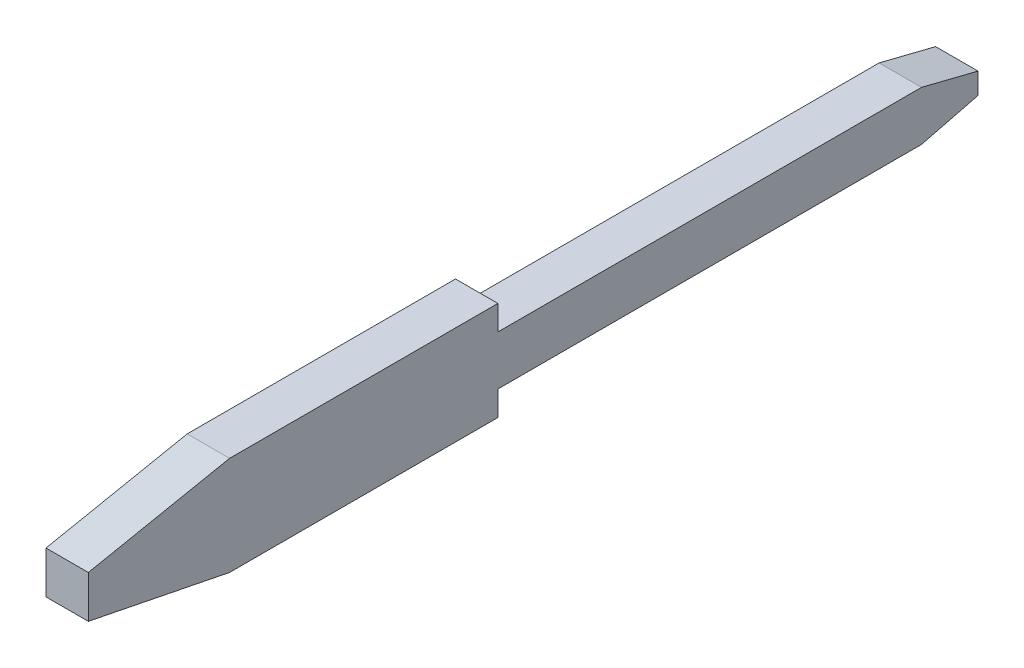
ISO-10303-21;
HEADER;
FILE_DESCRIPTION(('STEP AP214'),'2;1');
FILE_NAME('part.step','',(''),(''),'','','');
FILE_SCHEMA(('AUTOMOTIVE_DESIGN { 1 0 10303 214 1 1 1 1 }'));
ENDSEC;
DATA;
#1=APPLICATION_CONTEXT('core data for automotive mechanical design processes');
#2=APPLICATION_PROTOCOL_DEFINITION('international standard','automotive_design',2000,#1);
#3=PRODUCT_CONTEXT('',#1,'mechanical');
#4=PRODUCT('Part','Part','',(#3));
#5=PRODUCT_RELATED_PRODUCT_CATEGORY('part','',(#4));
#6=PRODUCT_DEFINITION_FORMATION('','',#4);
#7=PRODUCT_DEFINITION_CONTEXT('part definition',#1,'design');
#8=PRODUCT_DEFINITION('design','',#6,#7);
#9=PRODUCT_DEFINITION_SHAPE('','',#8);
#10=(LENGTH_UNIT() NAMED_UNIT(*) SI_UNIT(.MILLI.,.METRE.));
#11=(NAMED_UNIT(*) PLANE_ANGLE_UNIT() SI_UNIT($,.RADIAN.));
#12=(NAMED_UNIT(*) SI_UNIT($,.STERADIAN.) SOLID_ANGLE_UNIT());
#13=UNCERTAINTY_MEASURE_WITH_UNIT(LENGTH_MEASURE(1.E-05),#10,'distance_accuracy_value','');
#14=(GEOMETRIC_REPRESENTATION_CONTEXT(3) GLOBAL_UNCERTAINTY_ASSIGNED_CONTEXT((#13)) GLOBAL_UNIT_ASSIGNED_CONTEXT((#10,
#11,#12)) REPRESENTATION_CONTEXT('',''));
#15=CARTESIAN_POINT('',(0.,0.,0.));
#16=DIRECTION('',(0.,0.,1.));
#17=DIRECTION('',(1.,0.,0.));
#18=AXIS2_PLACEMENT_3D('',#15,#16,#17);
#19=CARTESIAN_POINT('',(0.15,0.35,2.9));
#20=DIRECTION('',(0.,0.,-1.));
#21=DIRECTION('',(-1.,0.,0.));
#22=AXIS2_PLACEMENT_3D('',#19,#20,#21);
#23=PLANE('',#22);
#24=DIRECTION('',(0.,-1.,0.));
#25=VECTOR('',#24,1.);
#26=CARTESIAN_POINT('',(-0.15,0.35,2.9));
#27=LINE('',#26,#25);
#28=CARTESIAN_POINT('',(-0.15,0.15,2.9));
#29=VERTEX_POINT('',#28);
#30=CARTESIAN_POINT('',(-0.15,-0.15,2.9));
#31=VERTEX_POINT('',#30);
#32=EDGE_CURVE('E11',#29,#31,#27,.T.);
#33=ORIENTED_EDGE('',*,*,#32,.T.);
#34=DIRECTION('',(1.,0.,0.));
#35=VECTOR('',#34,1.);
#36=CARTESIAN_POINT('',(0.15,-0.15,2.9));
#37=LINE('',#36,#35);
#38=CARTESIAN_POINT('',(0.15,-0.15,2.9));
#39=VERTEX_POINT('',#38);
#40=EDGE_CURVE('E23',#31,#39,#37,.T.);
#41=ORIENTED_EDGE('',*,*,#40,.T.);
#42=DIRECTION('',(0.,-1.,0.));
#43=VECTOR('',#42,1.);
#44=CARTESIAN_POINT('',(0.15,0.35,2.9));
#45=LINE('',#44,#43);
#46=CARTESIAN_POINT('',(0.15,0.15,2.9));
#47=VERTEX_POINT('',#46);
#48=EDGE_CURVE('E186',#47,#39,#45,.T.);
#49=ORIENTED_EDGE('',*,*,#48,.F.);
#50=DIRECTION('',(-1.,0.,0.));
#51=VECTOR('',#50,1.);
#52=CARTESIAN_POINT('',(0.15,0.15,2.9));
#53=LINE('',#52,#51);
#54=EDGE_CURVE('E125',#47,#29,#53,.T.);
#55=ORIENTED_EDGE('',*,*,#54,.T.);
#56=EDGE_LOOP('',(#33,#41,#49,#55));
#57=FACE_BOUND('',#56,.T.);
#58=ADVANCED_FACE('F16',(#57),#23,.F.);
#59=CARTESIAN_POINT('',(0.15,-0.35,2.9));
#60=DIRECTION('',(0.,1.,0.));
#61=DIRECTION('',(0.,0.,1.));
#62=AXIS2_PLACEMENT_3D('',#59,#60,#61);
#63=PLANE('',#62);
#64=DIRECTION('',(0.,0.,-1.));
#65=VECTOR('',#64,1.);
#66=CARTESIAN_POINT('',(0.15,-0.35,2.9));
#67=LINE('',#66,#65);
#68=CARTESIAN_POINT('',(0.15,-0.349999999999999,1.90000000000001));
#69=VERTEX_POINT('',#68);
#70=CARTESIAN_POINT('',(0.15,-0.35,0.));
#71=VERTEX_POINT('',#70);
#72=EDGE_CURVE('E183',#69,#71,#67,.T.);
#73=ORIENTED_EDGE('',*,*,#72,.F.);
#74=DIRECTION('',(-1.,0.,0.));
#75=VECTOR('',#74,1.);
#76=CARTESIAN_POINT('',(0.15,-0.35,1.9));
#77=LINE('',#76,#75);
#78=CARTESIAN_POINT('',(-0.15,-0.35,1.9));
#79=VERTEX_POINT('',#78);
#80=EDGE_CURVE('E181',#69,#79,#77,.T.);
#81=ORIENTED_EDGE('',*,*,#80,.T.);
#82=DIRECTION('',(0.,0.,-1.));
#83=VECTOR('',#82,1.);
#84=CARTESIAN_POINT('',(-0.15,-0.35,2.9));
#85=LINE('',#84,#83);
#86=CARTESIAN_POINT('',(-0.15,-0.35,0.));
#87=VERTEX_POINT('',#86);
#88=EDGE_CURVE('E179',#79,#87,#85,.T.);
#89=ORIENTED_EDGE('',*,*,#88,.T.);
#90=DIRECTION('',(-1.,0.,0.));
#91=VECTOR('',#90,1.);
#92=CARTESIAN_POINT('',(0.15,-0.35,0.));
#93=LINE('',#92,#91);
#94=EDGE_CURVE('E176',#71,#87,#93,.T.);
#95=ORIENTED_EDGE('',*,*,#94,.F.);
#96=EDGE_LOOP('',(#73,#81,#89,#95));
#97=FACE_BOUND('',#96,.T.);
#98=ADVANCED_FACE('F195',(#97),#63,.F.);
#99=CARTESIAN_POINT('',(0.15,-0.35,0.));
#100=DIRECTION('',(0.,0.,1.));
#101=DIRECTION('',(0.,-1.,0.));
#102=AXIS2_PLACEMENT_3D('',#99,#100,#101);
#103=PLANE('',#102);
#104=DIRECTION('',(0.,1.,0.));
#105=VECTOR('',#104,1.);
#106=CARTESIAN_POINT('',(-0.15,-0.35,0.));
#107=LINE('',#106,#105);
#108=CARTESIAN_POINT('',(-0.15,-0.175,0.));
#109=VERTEX_POINT('',#108);
#110=EDGE_CURVE('E174',#87,#109,#107,.T.);
#111=ORIENTED_EDGE('',*,*,#110,.T.);
#112=DIRECTION('',(-1.,0.,0.));
#113=VECTOR('',#112,1.);
#114=CARTESIAN_POINT('',(0.15,-0.175,0.));
#115=LINE('',#114,#113);
#116=CARTESIAN_POINT('',(0.15,-0.175,0.));
#117=VERTEX_POINT('',#116);
#118=EDGE_CURVE('E171',#117,#109,#115,.T.);
#119=ORIENTED_EDGE('',*,*,#118,.F.);
#120=DIRECTION('',(0.,1.,0.));
#121=VECTOR('',#120,1.);
#122=CARTESIAN_POINT('',(0.15,-0.35,0.));
#123=LINE('',#122,#121);
#124=EDGE_CURVE('E168',#71,#117,#123,.T.);
#125=ORIENTED_EDGE('',*,*,#124,.F.);
#126=ORIENTED_EDGE('',*,*,#94,.T.);
#127=EDGE_LOOP('',(#111,#119,#125,#126));
#128=FACE_BOUND('',#127,.T.);
#129=ADVANCED_FACE('F203',(#128),#103,.F.);
#130=CARTESIAN_POINT('',(0.15,-0.175,0.));
#131=DIRECTION('',(0.,1.,0.));
#132=DIRECTION('',(0.,0.,1.));
#133=AXIS2_PLACEMENT_3D('',#130,#131,#132);
#134=PLANE('',#133);
#135=DIRECTION('',(0.,0.,-1.));
#136=VECTOR('',#135,1.);
#137=CARTESIAN_POINT('',(-0.15,-0.175,0.));
#138=LINE('',#137,#136);
#139=CARTESIAN_POINT('',(-0.15,-0.175,-3.));
#140=VERTEX_POINT('',#139);
#141=EDGE_CURVE('E166',#109,#140,#138,.T.);
#142=ORIENTED_EDGE('',*,*,#141,.T.);
#143=DIRECTION('',(1.,0.,0.));
#144=VECTOR('',#143,1.);
#145=CARTESIAN_POINT('',(0.15,-0.175,-3.));
#146=LINE('',#145,#144);
#147=CARTESIAN_POINT('',(0.15,-0.175,-3.));
#148=VERTEX_POINT('',#147);
#149=EDGE_CURVE('E164',#140,#148,#146,.T.);
#150=ORIENTED_EDGE('',*,*,#149,.T.);
#151=DIRECTION('',(0.,0.,-1.));
#152=VECTOR('',#151,1.);
#153=CARTESIAN_POINT('',(0.15,-0.175,0.));
#154=LINE('',#153,#152);
#155=EDGE_CURVE('E162',#117,#148,#154,.T.);
#156=ORIENTED_EDGE('',*,*,#155,.F.);
#157=ORIENTED_EDGE('',*,*,#118,.T.);
#158=EDGE_LOOP('',(#142,#150,#156,#157));
#159=FACE_BOUND('',#158,.T.);
#160=ADVANCED_FACE('F207',(#159),#134,.F.);
#161=CARTESIAN_POINT('',(0.15,-0.175,-3.4));
#162=DIRECTION('',(0.,0.,1.));
#163=DIRECTION('',(1.,0.,0.));
#164=AXIS2_PLACEMENT_3D('',#161,#162,#163);
#165=PLANE('',#164);
#166=DIRECTION('',(0.,1.,0.));
#167=VECTOR('',#166,1.);
#168=CARTESIAN_POINT('',(0.15,-0.175,-3.4));
#169=LINE('',#168,#167);
#170=CARTESIAN_POINT('',(0.15,-0.075,-3.4));
#171=VERTEX_POINT('',#170);
#172=CARTESIAN_POINT('',(0.15,0.0750000000000001,-3.4));
#173=VERTEX_POINT('',#172);
#174=EDGE_CURVE('E160',#171,#173,#169,.T.);
#175=ORIENTED_EDGE('',*,*,#174,.F.);
#176=DIRECTION('',(-1.,0.,0.));
#177=VECTOR('',#176,1.);
#178=CARTESIAN_POINT('',(0.15,-0.075,-3.4));
#179=LINE('',#178,#177);
#180=CARTESIAN_POINT('',(-0.15,-0.075,-3.4));
#181=VERTEX_POINT('',#180);
#182=EDGE_CURVE('E158',#171,#181,#179,.T.);
#183=ORIENTED_EDGE('',*,*,#182,.T.);
#184=DIRECTION('',(0.,1.,0.));
#185=VECTOR('',#184,1.);
#186=CARTESIAN_POINT('',(-0.15,-0.175,-3.4));
#187=LINE('',#186,#185);
#188=CARTESIAN_POINT('',(-0.15,0.075,-3.4));
#189=VERTEX_POINT('',#188);
#190=EDGE_CURVE('E156',#181,#189,#187,.T.);
#191=ORIENTED_EDGE('',*,*,#190,.T.);
#192=DIRECTION('',(1.,0.,0.));
#193=VECTOR('',#192,1.);
#194=CARTESIAN_POINT('',(0.15,0.075,-3.4));
#195=LINE('',#194,#193);
#196=EDGE_CURVE('E153',#189,#173,#195,.T.);
#197=ORIENTED_EDGE('',*,*,#196,.T.);
#198=EDGE_LOOP('',(#175,#183,#191,#197));
#199=FACE_BOUND('',#198,.T.);
#200=ADVANCED_FACE('F215',(#199),#165,.F.);
#201=CARTESIAN_POINT('',(0.15,0.175,-3.4));
#202=DIRECTION('',(0.,-1.,0.));
#203=DIRECTION('',(0.,0.,-1.));
#204=AXIS2_PLACEMENT_3D('',#201,#202,#203);
#205=PLANE('',#204);
#206=DIRECTION('',(0.,0.,1.));
#207=VECTOR('',#206,1.);
#208=CARTESIAN_POINT('',(0.15,0.175,-3.4));
#209=LINE('',#208,#207);
#210=CARTESIAN_POINT('',(0.15,0.175,-3.));
#211=VERTEX_POINT('',#210);
#212=CARTESIAN_POINT('',(0.15,0.175,0.));
#213=VERTEX_POINT('',#212);
#214=EDGE_CURVE('E151',#211,#213,#209,.T.);
#215=ORIENTED_EDGE('',*,*,#214,.F.);
#216=DIRECTION('',(-1.,0.,0.));
#217=VECTOR('',#216,1.);
#218=CARTESIAN_POINT('',(0.15,0.175,-3.));
#219=LINE('',#218,#217);
#220=CARTESIAN_POINT('',(-0.15,0.175,-3.));
#221=VERTEX_POINT('',#220);
#222=EDGE_CURVE('E149',#211,#221,#219,.T.);
#223=ORIENTED_EDGE('',*,*,#222,.T.);
#224=DIRECTION('',(0.,0.,1.));
#225=VECTOR('',#224,1.);
#226=CARTESIAN_POINT('',(-0.15,0.175,-3.4));
#227=LINE('',#226,#225);
#228=CARTESIAN_POINT('',(-0.15,0.175,0.));
#229=VERTEX_POINT('',#228);
#230=EDGE_CURVE('E147',#221,#229,#227,.T.);
#231=ORIENTED_EDGE('',*,*,#230,.T.);
#232=DIRECTION('',(-1.,0.,0.));
#233=VECTOR('',#232,1.);
#234=CARTESIAN_POINT('',(0.15,0.175,0.));
#235=LINE('',#234,#233);
#236=EDGE_CURVE('E144',#213,#229,#235,.T.);
#237=ORIENTED_EDGE('',*,*,#236,.F.);
#238=EDGE_LOOP('',(#215,#223,#231,#237));
#239=FACE_BOUND('',#238,.T.);
#240=ADVANCED_FACE('F232',(#239),#205,.F.);
#241=CARTESIAN_POINT('',(0.15,0.175,0.));
#242=DIRECTION('',(0.,0.,1.));
#243=DIRECTION('',(1.,0.,0.));
#244=AXIS2_PLACEMENT_3D('',#241,#242,#243);
#245=PLANE('',#244);
#246=DIRECTION('',(0.,1.,0.));
#247=VECTOR('',#246,1.);
#248=CARTESIAN_POINT('',(-0.15,0.175,0.));
#249=LINE('',#248,#247);
#250=CARTESIAN_POINT('',(-0.15,0.35,0.));
#251=VERTEX_POINT('',#250);
#252=EDGE_CURVE('E142',#229,#251,#249,.T.);
#253=ORIENTED_EDGE('',*,*,#252,.T.);
#254=DIRECTION('',(-1.,0.,0.));
#255=VECTOR('',#254,1.);
#256=CARTESIAN_POINT('',(0.15,0.35,0.));
#257=LINE('',#256,#255);
#258=CARTESIAN_POINT('',(0.15,0.35,0.));
#259=VERTEX_POINT('',#258);
#260=EDGE_CURVE('E140',#259,#251,#257,.T.);
#261=ORIENTED_EDGE('',*,*,#260,.F.);
#262=DIRECTION('',(0.,1.,0.));
#263=VECTOR('',#262,1.);
#264=CARTESIAN_POINT('',(0.15,0.175,0.));
#265=LINE('',#264,#263);
#266=EDGE_CURVE('E120',#213,#259,#265,.T.);
#267=ORIENTED_EDGE('',*,*,#266,.F.);
#268=ORIENTED_EDGE('',*,*,#236,.T.);
#269=EDGE_LOOP('',(#253,#261,#267,#268));
#270=FACE_BOUND('',#269,.T.);
#271=ADVANCED_FACE('F229',(#270),#245,.F.);
#272=CARTESIAN_POINT('',(0.15,0.35,0.));
#273=DIRECTION('',(0.,-1.,0.));
#274=DIRECTION('',(0.,0.,-1.));
#275=AXIS2_PLACEMENT_3D('',#272,#273,#274);
#276=PLANE('',#275);
#277=DIRECTION('',(0.,0.,1.));
#278=VECTOR('',#277,1.);
#279=CARTESIAN_POINT('',(-0.15,0.35,0.));
#280=LINE('',#279,#278);
#281=CARTESIAN_POINT('',(-0.15,0.35,1.9));
#282=VERTEX_POINT('',#281);
#283=EDGE_CURVE('E107',#251,#282,#280,.T.);
#284=ORIENTED_EDGE('',*,*,#283,.T.);
#285=DIRECTION('',(1.,0.,0.));
#286=VECTOR('',#285,1.);
#287=CARTESIAN_POINT('',(0.15,0.35,1.9));
#288=LINE('',#287,#286);
#289=CARTESIAN_POINT('',(0.15,0.35,1.9));
#290=VERTEX_POINT('',#289);
#291=EDGE_CURVE('E101',#282,#290,#288,.T.);
#292=ORIENTED_EDGE('',*,*,#291,.T.);
#293=DIRECTION('',(0.,0.,1.));
#294=VECTOR('',#293,1.);
#295=CARTESIAN_POINT('',(0.15,0.35,0.));
#296=LINE('',#295,#294);
#297=EDGE_CURVE('E105',#259,#290,#296,.T.);
#298=ORIENTED_EDGE('',*,*,#297,.F.);
#299=ORIENTED_EDGE('',*,*,#260,.T.);
#300=EDGE_LOOP('',(#284,#292,#298,#299));
#301=FACE_BOUND('',#300,.T.);
#302=ADVANCED_FACE('F103',(#301),#276,.F.);
#303=CARTESIAN_POINT('',(0.15,0.,0.));
#304=DIRECTION('',(1.,0.,0.));
#305=DIRECTION('',(0.,0.,-1.));
#306=AXIS2_PLACEMENT_3D('',#303,#304,#305);
#307=PLANE('',#306);
#308=ORIENTED_EDGE('',*,*,#155,.T.);
#309=DIRECTION('',(0.,-0.242535625036333,0.970142500145332));
#310=VECTOR('',#309,1.);
#311=CARTESIAN_POINT('',(0.15,-0.870588235294117,-0.217647058823529));
#312=LINE('',#311,#310);
#313=EDGE_CURVE('E121',#171,#148,#312,.T.);
#314=ORIENTED_EDGE('',*,*,#313,.F.);
#315=ORIENTED_EDGE('',*,*,#174,.T.);
#316=DIRECTION('',(0.,-0.242535625036333,-0.970142500145332));
#317=VECTOR('',#316,1.);
#318=CARTESIAN_POINT('',(0.15,0.870588235294117,-0.217647058823529));
#319=LINE('',#318,#317);
#320=EDGE_CURVE('E126',#211,#173,#319,.T.);
#321=ORIENTED_EDGE('',*,*,#320,.F.);
#322=ORIENTED_EDGE('',*,*,#214,.T.);
#323=ORIENTED_EDGE('',*,*,#266,.T.);
#324=ORIENTED_EDGE('',*,*,#297,.T.);
#325=DIRECTION('',(0.,0.196116135138184,-0.98058067569092));
#326=VECTOR('',#325,1.);
#327=CARTESIAN_POINT('',(0.15,0.701923076923077,0.140384615384615));
#328=LINE('',#327,#326);
#329=EDGE_CURVE('E118',#47,#290,#328,.T.);
#330=ORIENTED_EDGE('',*,*,#329,.F.);
#331=ORIENTED_EDGE('',*,*,#48,.T.);
#332=DIRECTION('',(0.,0.196116135138184,0.98058067569092));
#333=VECTOR('',#332,1.);
#334=CARTESIAN_POINT('',(0.15,-0.701923076923077,0.140384615384615));
#335=LINE('',#334,#333);
#336=EDGE_CURVE('E127',#69,#39,#335,.T.);
#337=ORIENTED_EDGE('',*,*,#336,.F.);
#338=ORIENTED_EDGE('',*,*,#72,.T.);
#339=ORIENTED_EDGE('',*,*,#124,.T.);
#340=EDGE_LOOP('',(#308,#314,#315,#321,#322,#323,#324,#330,#331,#337,#338,#339));
#341=FACE_BOUND('',#340,.T.);
#342=ADVANCED_FACE('F116',(#341),#307,.T.);
#343=CARTESIAN_POINT('',(-0.15,0.,0.));
#344=DIRECTION('',(1.,0.,0.));
#345=DIRECTION('',(0.,0.,-1.));
#346=AXIS2_PLACEMENT_3D('',#343,#344,#345);
#347=PLANE('',#346);
#348=ORIENTED_EDGE('',*,*,#190,.F.);
#349=DIRECTION('',(0.,0.242535625036333,-0.970142500145332));
#350=VECTOR('',#349,1.);
#351=CARTESIAN_POINT('',(-0.15,-0.075,-3.4));
#352=LINE('',#351,#350);
#353=EDGE_CURVE('E132',#140,#181,#352,.T.);
#354=ORIENTED_EDGE('',*,*,#353,.F.);
#355=ORIENTED_EDGE('',*,*,#141,.F.);
#356=ORIENTED_EDGE('',*,*,#110,.F.);
#357=ORIENTED_EDGE('',*,*,#88,.F.);
#358=DIRECTION('',(0.,-0.196116135138184,-0.98058067569092));
#359=VECTOR('',#358,1.);
#360=CARTESIAN_POINT('',(-0.15,-0.35,1.9));
#361=LINE('',#360,#359);
#362=EDGE_CURVE('E192',#31,#79,#361,.T.);
#363=ORIENTED_EDGE('',*,*,#362,.F.);
#364=ORIENTED_EDGE('',*,*,#32,.F.);
#365=DIRECTION('',(0.,-0.196116135138184,0.98058067569092));
#366=VECTOR('',#365,1.);
#367=CARTESIAN_POINT('',(-0.15,0.15,2.9));
#368=LINE('',#367,#366);
#369=EDGE_CURVE('E224',#282,#29,#368,.T.);
#370=ORIENTED_EDGE('',*,*,#369,.F.);
#371=ORIENTED_EDGE('',*,*,#283,.F.);
#372=ORIENTED_EDGE('',*,*,#252,.F.);
#373=ORIENTED_EDGE('',*,*,#230,.F.);
#374=DIRECTION('',(0.,0.242535625036333,0.970142500145332));
#375=VECTOR('',#374,1.);
#376=CARTESIAN_POINT('',(-0.15,0.175,-3.));
#377=LINE('',#376,#375);
#378=EDGE_CURVE('E220',#189,#221,#377,.T.);
#379=ORIENTED_EDGE('',*,*,#378,.F.);
#380=EDGE_LOOP('',(#348,#354,#355,#356,#357,#363,#364,#370,#371,#372,#373,#379));
#381=FACE_BOUND('',#380,.T.);
#382=ADVANCED_FACE('F199',(#381),#347,.F.);
#383=CARTESIAN_POINT('',(0.15,-0.35,1.9));
#384=DIRECTION('',(0.,0.98058067569092,-0.196116135138184));
#385=DIRECTION('',(-1.,0.,0.));
#386=AXIS2_PLACEMENT_3D('',#383,#384,#385);
#387=PLANE('',#386);
#388=ORIENTED_EDGE('',*,*,#336,.T.);
#389=ORIENTED_EDGE('',*,*,#40,.F.);
#390=ORIENTED_EDGE('',*,*,#362,.T.);
#391=ORIENTED_EDGE('',*,*,#80,.F.);
#392=EDGE_LOOP('',(#388,#389,#390,#391));
#393=FACE_BOUND('',#392,.T.);
#394=ADVANCED_FACE('F191',(#393),#387,.F.);
#395=CARTESIAN_POINT('',(0.15,0.15,2.9));
#396=DIRECTION('',(0.,-0.98058067569092,-0.196116135138184));
#397=DIRECTION('',(-1.,0.,0.));
#398=AXIS2_PLACEMENT_3D('',#395,#396,#397);
#399=PLANE('',#398);
#400=ORIENTED_EDGE('',*,*,#329,.T.);
#401=ORIENTED_EDGE('',*,*,#291,.F.);
#402=ORIENTED_EDGE('',*,*,#369,.T.);
#403=ORIENTED_EDGE('',*,*,#54,.F.);
#404=EDGE_LOOP('',(#400,#401,#402,#403));
#405=FACE_BOUND('',#404,.T.);
#406=ADVANCED_FACE('F124',(#405),#399,.F.);
#407=CARTESIAN_POINT('',(0.15,-0.075,-3.4));
#408=DIRECTION('',(0.,0.970142500145332,0.242535625036333));
#409=DIRECTION('',(-1.,0.,0.));
#410=AXIS2_PLACEMENT_3D('',#407,#408,#409);
#411=PLANE('',#410);
#412=ORIENTED_EDGE('',*,*,#313,.T.);
#413=ORIENTED_EDGE('',*,*,#149,.F.);
#414=ORIENTED_EDGE('',*,*,#353,.T.);
#415=ORIENTED_EDGE('',*,*,#182,.F.);
#416=EDGE_LOOP('',(#412,#413,#414,#415));
#417=FACE_BOUND('',#416,.T.);
#418=ADVANCED_FACE('F212',(#417),#411,.F.);
#419=CARTESIAN_POINT('',(0.15,0.175,-3.));
#420=DIRECTION('',(0.,-0.970142500145332,0.242535625036333));
#421=DIRECTION('',(-1.,0.,0.));
#422=AXIS2_PLACEMENT_3D('',#419,#420,#421);
#423=PLANE('',#422);
#424=ORIENTED_EDGE('',*,*,#320,.T.);
#425=ORIENTED_EDGE('',*,*,#196,.F.);
#426=ORIENTED_EDGE('',*,*,#378,.T.);
#427=ORIENTED_EDGE('',*,*,#222,.F.);
#428=EDGE_LOOP('',(#424,#425,#426,#427));
#429=FACE_BOUND('',#428,.T.);
#430=ADVANCED_FACE('F234',(#429),#423,.F.);
#431=CLOSED_SHELL('',(#58,#98,#129,#160,#200,#240,#271,#302,#342,#382,#394,#406,#418,#430));
#432=MANIFOLD_SOLID_BREP('B1',#431);
#433=ADVANCED_BREP_SHAPE_REPRESENTATION('',(#18,#432),#14);
#434=SHAPE_DEFINITION_REPRESENTATION(#9,#433);
ENDSEC;
END-ISO-10303-21;
